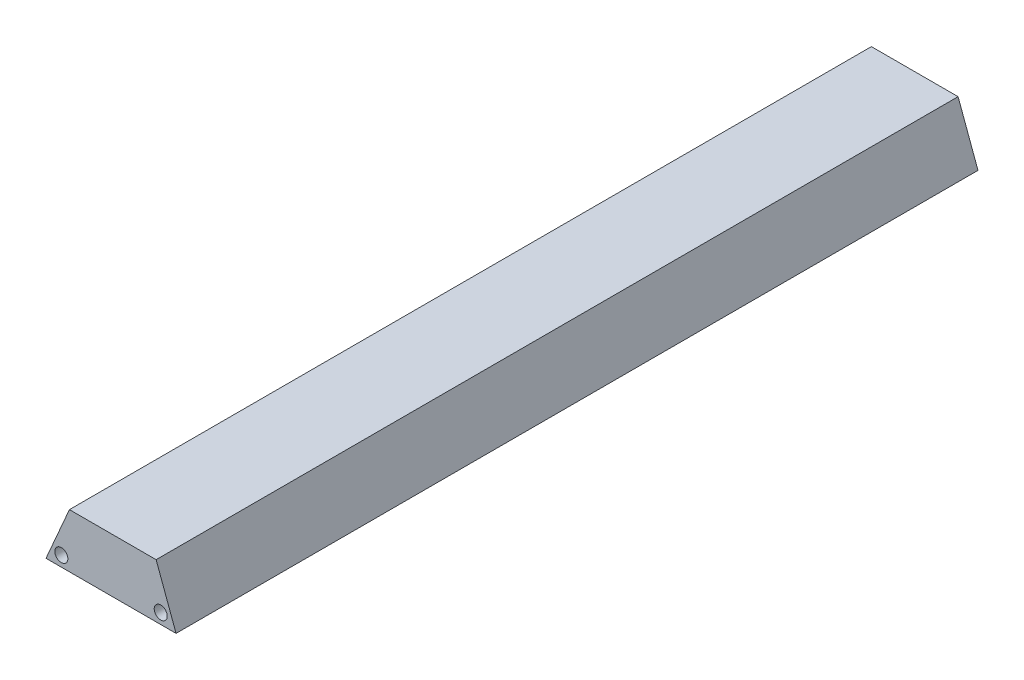
ISO-10303-21;
HEADER;
FILE_DESCRIPTION(('STEP AP214'),'2;1');
FILE_NAME('part.step','',(''),(''),'','','');
FILE_SCHEMA(('AUTOMOTIVE_DESIGN { 1 0 10303 214 1 1 1 1 }'));
ENDSEC;
DATA;
#1=APPLICATION_CONTEXT('core data for automotive mechanical design processes');
#2=APPLICATION_PROTOCOL_DEFINITION('international standard','automotive_design',2000,#1);
#3=PRODUCT_CONTEXT('',#1,'mechanical');
#4=PRODUCT('Part','Part','',(#3));
#5=PRODUCT_RELATED_PRODUCT_CATEGORY('part','',(#4));
#6=PRODUCT_DEFINITION_FORMATION('','',#4);
#7=PRODUCT_DEFINITION_CONTEXT('part definition',#1,'design');
#8=PRODUCT_DEFINITION('design','',#6,#7);
#9=PRODUCT_DEFINITION_SHAPE('','',#8);
#10=(LENGTH_UNIT() NAMED_UNIT(*) SI_UNIT(.MILLI.,.METRE.));
#11=(NAMED_UNIT(*) PLANE_ANGLE_UNIT() SI_UNIT($,.RADIAN.));
#12=(NAMED_UNIT(*) SI_UNIT($,.STERADIAN.) SOLID_ANGLE_UNIT());
#13=UNCERTAINTY_MEASURE_WITH_UNIT(LENGTH_MEASURE(1.E-05),#10,'distance_accuracy_value','');
#14=(GEOMETRIC_REPRESENTATION_CONTEXT(3) GLOBAL_UNCERTAINTY_ASSIGNED_CONTEXT((#13)) GLOBAL_UNIT_ASSIGNED_CONTEXT((#10,
#11,#12)) REPRESENTATION_CONTEXT('',''));
#15=CARTESIAN_POINT('',(0.,0.,0.));
#16=DIRECTION('',(0.,0.,1.));
#17=DIRECTION('',(1.,0.,0.));
#18=AXIS2_PLACEMENT_3D('',#15,#16,#17);
#19=CARTESIAN_POINT('',(-3.03675893715023,-1.29483184073045,-18.5));
#20=DIRECTION('',(-0.917070056253235,0.39872611141445,0.));
#21=DIRECTION('',(-0.39872611141445,-0.917070056253235,0.));
#22=AXIS2_PLACEMENT_3D('',#19,#20,#21);
#23=PLANE('',#22);
#24=DIRECTION('',(0.,0.,1.));
#25=VECTOR('',#24,1.);
#26=CARTESIAN_POINT('',(-3.03675893715023,-1.29483184073045,-18.5));
#27=LINE('',#26,#25);
#28=CARTESIAN_POINT('',(-3.03675893715023,-1.29483184073045,-18.5));
#29=VERTEX_POINT('',#28);
#30=CARTESIAN_POINT('',(-3.03675893715023,-1.29483184073045,18.5));
#31=VERTEX_POINT('',#30);
#32=EDGE_CURVE('E35',#29,#31,#27,.T.);
#33=ORIENTED_EDGE('',*,*,#32,.T.);
#34=DIRECTION('',(-0.39872611141445,-0.917070056253235,0.));
#35=VECTOR('',#34,1.);
#36=CARTESIAN_POINT('',(-3.03675893715023,-1.29483184073045,18.5));
#37=LINE('',#36,#35);
#38=CARTESIAN_POINT('',(-1.95567785606915,1.19165464575603,18.5));
#39=VERTEX_POINT('',#38);
#40=EDGE_CURVE('E72',#39,#31,#37,.T.);
#41=ORIENTED_EDGE('',*,*,#40,.F.);
#42=DIRECTION('',(0.,0.,1.));
#43=VECTOR('',#42,1.);
#44=CARTESIAN_POINT('',(-1.95567785606915,1.19165464575603,-18.5));
#45=LINE('',#44,#43);
#46=CARTESIAN_POINT('',(-1.95567785606915,1.19165464575603,-18.5));
#47=VERTEX_POINT('',#46);
#48=EDGE_CURVE('E11',#47,#39,#45,.T.);
#49=ORIENTED_EDGE('',*,*,#48,.F.);
#50=DIRECTION('',(-0.39872611141445,-0.917070056253235,0.));
#51=VECTOR('',#50,1.);
#52=CARTESIAN_POINT('',(-3.03675893715023,-1.29483184073045,-18.5));
#53=LINE('',#52,#51);
#54=EDGE_CURVE('E73',#47,#29,#53,.T.);
#55=ORIENTED_EDGE('',*,*,#54,.T.);
#56=EDGE_LOOP('',(#33,#41,#49,#55));
#57=FACE_BOUND('',#56,.T.);
#58=ADVANCED_FACE('F32',(#57),#23,.T.);
#59=CARTESIAN_POINT('',(-1.95567785606915,1.19165464575603,-18.5));
#60=DIRECTION('',(0.,1.,0.));
#61=DIRECTION('',(0.,0.,1.));
#62=AXIS2_PLACEMENT_3D('',#59,#60,#61);
#63=PLANE('',#62);
#64=ORIENTED_EDGE('',*,*,#48,.T.);
#65=DIRECTION('',(-1.,0.,0.));
#66=VECTOR('',#65,1.);
#67=CARTESIAN_POINT('',(-1.95567785606915,1.19165464575603,18.5));
#68=LINE('',#67,#66);
#69=CARTESIAN_POINT('',(2.04432214393085,1.19165464575603,18.5));
#70=VERTEX_POINT('',#69);
#71=EDGE_CURVE('E90',#70,#39,#68,.T.);
#72=ORIENTED_EDGE('',*,*,#71,.F.);
#73=DIRECTION('',(0.,0.,1.));
#74=VECTOR('',#73,1.);
#75=CARTESIAN_POINT('',(2.04432214393085,1.19165464575603,-18.5));
#76=LINE('',#75,#74);
#77=CARTESIAN_POINT('',(2.04432214393085,1.19165464575603,-18.5));
#78=VERTEX_POINT('',#77);
#79=EDGE_CURVE('E40',#78,#70,#76,.T.);
#80=ORIENTED_EDGE('',*,*,#79,.F.);
#81=DIRECTION('',(-1.,0.,0.));
#82=VECTOR('',#81,1.);
#83=CARTESIAN_POINT('',(-1.95567785606915,1.19165464575603,-18.5));
#84=LINE('',#83,#82);
#85=EDGE_CURVE('E78',#78,#47,#84,.T.);
#86=ORIENTED_EDGE('',*,*,#85,.T.);
#87=EDGE_LOOP('',(#64,#72,#80,#86));
#88=FACE_BOUND('',#87,.T.);
#89=ADVANCED_FACE('F116',(#88),#63,.T.);
#90=CARTESIAN_POINT('',(2.04432214393085,1.19165464575603,-18.5));
#91=DIRECTION('',(0.937994498829113,0.346650140871629,0.));
#92=DIRECTION('',(-0.346650140871629,0.937994498829113,0.));
#93=AXIS2_PLACEMENT_3D('',#90,#91,#92);
#94=PLANE('',#93);
#95=ORIENTED_EDGE('',*,*,#79,.T.);
#96=DIRECTION('',(-0.346650140871629,0.937994498829113,0.));
#97=VECTOR('',#96,1.);
#98=CARTESIAN_POINT('',(2.04432214393085,1.19165464575603,18.5));
#99=LINE('',#98,#97);
#100=CARTESIAN_POINT('',(2.96324106284977,-1.29483184073045,18.5));
#101=VERTEX_POINT('',#100);
#102=EDGE_CURVE('E85',#101,#70,#99,.T.);
#103=ORIENTED_EDGE('',*,*,#102,.F.);
#104=DIRECTION('',(0.,0.,1.));
#105=VECTOR('',#104,1.);
#106=CARTESIAN_POINT('',(2.96324106284977,-1.29483184073045,-18.5));
#107=LINE('',#106,#105);
#108=CARTESIAN_POINT('',(2.96324106284977,-1.29483184073045,-18.5));
#109=VERTEX_POINT('',#108);
#110=EDGE_CURVE('E77',#109,#101,#107,.T.);
#111=ORIENTED_EDGE('',*,*,#110,.F.);
#112=DIRECTION('',(-0.346650140871629,0.937994498829113,0.));
#113=VECTOR('',#112,1.);
#114=CARTESIAN_POINT('',(2.04432214393085,1.19165464575603,-18.5));
#115=LINE('',#114,#113);
#116=EDGE_CURVE('E109',#109,#78,#115,.T.);
#117=ORIENTED_EDGE('',*,*,#116,.T.);
#118=EDGE_LOOP('',(#95,#103,#111,#117));
#119=FACE_BOUND('',#118,.T.);
#120=ADVANCED_FACE('F113',(#119),#94,.T.);
#121=CARTESIAN_POINT('',(2.96324106284977,-1.29483184073045,-18.5));
#122=DIRECTION('',(0.,-1.,0.));
#123=DIRECTION('',(1.,0.,0.));
#124=AXIS2_PLACEMENT_3D('',#121,#122,#123);
#125=PLANE('',#124);
#126=ORIENTED_EDGE('',*,*,#110,.T.);
#127=DIRECTION('',(1.,0.,0.));
#128=VECTOR('',#127,1.);
#129=CARTESIAN_POINT('',(2.96324106284977,-1.29483184073045,18.5));
#130=LINE('',#129,#128);
#131=EDGE_CURVE('E80',#31,#101,#130,.T.);
#132=ORIENTED_EDGE('',*,*,#131,.F.);
#133=ORIENTED_EDGE('',*,*,#32,.F.);
#134=DIRECTION('',(1.,0.,0.));
#135=VECTOR('',#134,1.);
#136=CARTESIAN_POINT('',(2.96324106284977,-1.29483184073045,-18.5));
#137=LINE('',#136,#135);
#138=EDGE_CURVE('E107',#29,#109,#137,.T.);
#139=ORIENTED_EDGE('',*,*,#138,.T.);
#140=EDGE_LOOP('',(#126,#132,#133,#139));
#141=FACE_BOUND('',#140,.T.);
#142=ADVANCED_FACE('F81',(#141),#125,.T.);
#143=CARTESIAN_POINT('',(0.,0.,-18.5));
#144=DIRECTION('',(0.,0.,-1.));
#145=DIRECTION('',(-1.,0.,0.));
#146=AXIS2_PLACEMENT_3D('',#143,#144,#145);
#147=PLANE('',#146);
#148=CARTESIAN_POINT('',(-2.32968205138154,-0.813020010925633,-18.5));
#149=DIRECTION('',(0.,0.,1.));
#150=DIRECTION('',(-1.,0.,0.));
#151=AXIS2_PLACEMENT_3D('',#148,#149,#150);
#152=CIRCLE('',#151,0.3);
#153=CARTESIAN_POINT('',(-2.62968205138153,-0.813020010925633,-18.5));
#154=VERTEX_POINT('',#153);
#155=EDGE_CURVE('E100',#154,#154,#152,.T.);
#156=ORIENTED_EDGE('',*,*,#155,.T.);
#157=EDGE_LOOP('',(#156));
#158=FACE_BOUND('',#157,.T.);
#159=CARTESIAN_POINT('',(2.25616417708107,-0.813020010925633,-18.5));
#160=DIRECTION('',(0.,0.,1.));
#161=DIRECTION('',(1.,0.,0.));
#162=AXIS2_PLACEMENT_3D('',#159,#160,#161);
#163=CIRCLE('',#162,0.3);
#164=CARTESIAN_POINT('',(2.55616417708107,-0.813020010925633,-18.5));
#165=VERTEX_POINT('',#164);
#166=EDGE_CURVE('E103',#165,#165,#163,.T.);
#167=ORIENTED_EDGE('',*,*,#166,.T.);
#168=EDGE_LOOP('',(#167));
#169=FACE_BOUND('',#168,.T.);
#170=ORIENTED_EDGE('',*,*,#54,.F.);
#171=ORIENTED_EDGE('',*,*,#85,.F.);
#172=ORIENTED_EDGE('',*,*,#116,.F.);
#173=ORIENTED_EDGE('',*,*,#138,.F.);
#174=EDGE_LOOP('',(#170,#171,#172,#173));
#175=FACE_BOUND('',#174,.T.);
#176=ADVANCED_FACE('F118',(#158,#169,#175),#147,.T.);
#177=CARTESIAN_POINT('',(2.25616417708107,-0.813020010925633,-18.5));
#178=DIRECTION('',(0.,0.,1.));
#179=DIRECTION('',(1.,0.,0.));
#180=AXIS2_PLACEMENT_3D('',#177,#178,#179);
#181=CYLINDRICAL_SURFACE('',#180,0.3);
#182=ORIENTED_EDGE('',*,*,#166,.F.);
#183=EDGE_LOOP('',(#182));
#184=FACE_BOUND('',#183,.T.);
#185=CARTESIAN_POINT('',(2.25616417708107,-0.813020010925633,18.5));
#186=DIRECTION('',(0.,0.,1.));
#187=DIRECTION('',(1.,0.,0.));
#188=AXIS2_PLACEMENT_3D('',#185,#186,#187);
#189=CIRCLE('',#188,0.3);
#190=CARTESIAN_POINT('',(2.55616417708107,-0.813020010925633,18.5));
#191=VERTEX_POINT('',#190);
#192=EDGE_CURVE('E91',#191,#191,#189,.T.);
#193=ORIENTED_EDGE('',*,*,#192,.T.);
#194=EDGE_LOOP('',(#193));
#195=FACE_BOUND('',#194,.T.);
#196=ADVANCED_FACE('F120',(#184,#195),#181,.F.);
#197=CARTESIAN_POINT('',(-2.32968205138154,-0.813020010925633,-18.5));
#198=DIRECTION('',(0.,0.,1.));
#199=DIRECTION('',(1.,0.,0.));
#200=AXIS2_PLACEMENT_3D('',#197,#198,#199);
#201=CYLINDRICAL_SURFACE('',#200,0.3);
#202=ORIENTED_EDGE('',*,*,#155,.F.);
#203=EDGE_LOOP('',(#202));
#204=FACE_BOUND('',#203,.T.);
#205=CARTESIAN_POINT('',(-2.32968205138154,-0.813020010925633,18.5));
#206=DIRECTION('',(0.,0.,1.));
#207=DIRECTION('',(-1.,0.,0.));
#208=AXIS2_PLACEMENT_3D('',#205,#206,#207);
#209=CIRCLE('',#208,0.3);
#210=CARTESIAN_POINT('',(-2.62968205138153,-0.813020010925633,18.5));
#211=VERTEX_POINT('',#210);
#212=EDGE_CURVE('E94',#211,#211,#209,.T.);
#213=ORIENTED_EDGE('',*,*,#212,.T.);
#214=EDGE_LOOP('',(#213));
#215=FACE_BOUND('',#214,.T.);
#216=ADVANCED_FACE('F127',(#204,#215),#201,.F.);
#217=CARTESIAN_POINT('',(0.,0.,18.5));
#218=DIRECTION('',(0.,0.,-1.));
#219=DIRECTION('',(-1.,0.,0.));
#220=AXIS2_PLACEMENT_3D('',#217,#218,#219);
#221=PLANE('',#220);
#222=ORIENTED_EDGE('',*,*,#40,.T.);
#223=ORIENTED_EDGE('',*,*,#131,.T.);
#224=ORIENTED_EDGE('',*,*,#102,.T.);
#225=ORIENTED_EDGE('',*,*,#71,.T.);
#226=EDGE_LOOP('',(#222,#223,#224,#225));
#227=FACE_BOUND('',#226,.T.);
#228=ORIENTED_EDGE('',*,*,#192,.F.);
#229=EDGE_LOOP('',(#228));
#230=FACE_BOUND('',#229,.T.);
#231=ORIENTED_EDGE('',*,*,#212,.F.);
#232=EDGE_LOOP('',(#231));
#233=FACE_BOUND('',#232,.T.);
#234=ADVANCED_FACE('F88',(#227,#230,#233),#221,.F.);
#235=CLOSED_SHELL('',(#58,#89,#120,#142,#176,#196,#216,#234));
#236=MANIFOLD_SOLID_BREP('B2',#235);
#237=ADVANCED_BREP_SHAPE_REPRESENTATION('',(#18,#236),#14);
#238=SHAPE_DEFINITION_REPRESENTATION(#9,#237);
ENDSEC;
END-ISO-10303-21;
